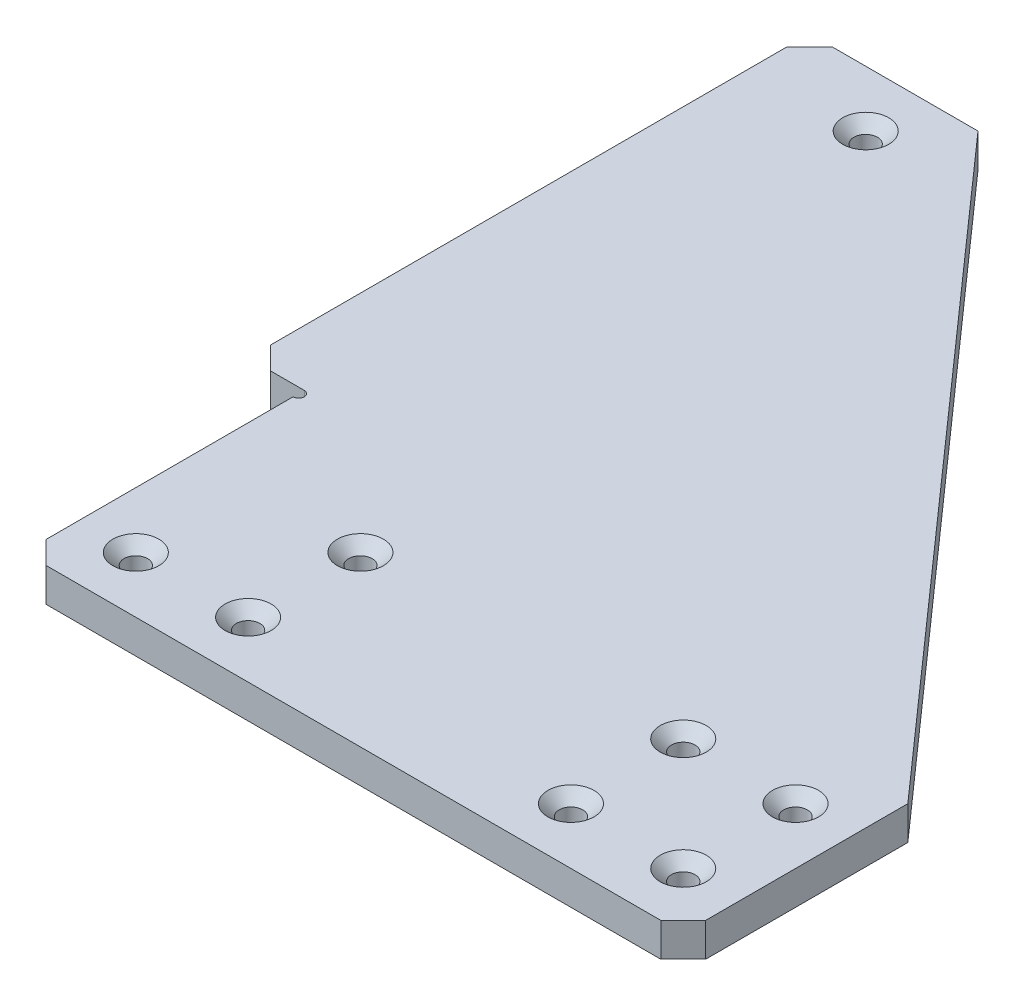
ISO-10303-21;
HEADER;
FILE_DESCRIPTION(('STEP AP214'),'2;1');
FILE_NAME('part.step','',(''),(''),'','','');
FILE_SCHEMA(('AUTOMOTIVE_DESIGN { 1 0 10303 214 1 1 1 1 }'));
ENDSEC;
DATA;
#1=APPLICATION_CONTEXT('core data for automotive mechanical design processes');
#2=APPLICATION_PROTOCOL_DEFINITION('international standard','automotive_design',2000,#1);
#3=PRODUCT_CONTEXT('',#1,'mechanical');
#4=PRODUCT('Part','Part','',(#3));
#5=PRODUCT_RELATED_PRODUCT_CATEGORY('part','',(#4));
#6=PRODUCT_DEFINITION_FORMATION('','',#4);
#7=PRODUCT_DEFINITION_CONTEXT('part definition',#1,'design');
#8=PRODUCT_DEFINITION('design','',#6,#7);
#9=PRODUCT_DEFINITION_SHAPE('','',#8);
#10=(LENGTH_UNIT() NAMED_UNIT(*) SI_UNIT(.MILLI.,.METRE.));
#11=(NAMED_UNIT(*) PLANE_ANGLE_UNIT() SI_UNIT($,.RADIAN.));
#12=(NAMED_UNIT(*) SI_UNIT($,.STERADIAN.) SOLID_ANGLE_UNIT());
#13=UNCERTAINTY_MEASURE_WITH_UNIT(LENGTH_MEASURE(1.E-05),#10,'distance_accuracy_value','');
#14=(GEOMETRIC_REPRESENTATION_CONTEXT(3) GLOBAL_UNCERTAINTY_ASSIGNED_CONTEXT((#13)) GLOBAL_UNIT_ASSIGNED_CONTEXT((#10,
#11,#12)) REPRESENTATION_CONTEXT('',''));
#15=CARTESIAN_POINT('',(0.,0.,0.));
#16=DIRECTION('',(0.,0.,1.));
#17=DIRECTION('',(1.,0.,0.));
#18=AXIS2_PLACEMENT_3D('',#15,#16,#17);
#19=CARTESIAN_POINT('',(0.,3.,0.));
#20=DIRECTION('',(0.,1.,0.));
#21=DIRECTION('',(0.,0.,1.));
#22=AXIS2_PLACEMENT_3D('',#19,#20,#21);
#23=PLANE('',#22);
#24=CARTESIAN_POINT('',(48.75,3.,-10.));
#25=DIRECTION('',(0.,1.,0.));
#26=DIRECTION('',(0.,0.,1.));
#27=AXIS2_PLACEMENT_3D('',#24,#25,#26);
#28=CIRCLE('',#27,4.09999999999996);
#29=CARTESIAN_POINT('',(48.75,3.,-5.90000000000005));
#30=VERTEX_POINT('',#29);
#31=EDGE_CURVE('E244',#30,#30,#28,.F.);
#32=ORIENTED_EDGE('',*,*,#31,.T.);
#33=EDGE_LOOP('',(#32));
#34=FACE_BOUND('',#33,.T.);
#35=CARTESIAN_POINT('',(48.75,3.,-30.));
#36=DIRECTION('',(0.,1.,0.));
#37=DIRECTION('',(0.,0.,1.));
#38=AXIS2_PLACEMENT_3D('',#35,#36,#37);
#39=CIRCLE('',#38,4.10000000000005);
#40=CARTESIAN_POINT('',(48.75,3.,-25.9));
#41=VERTEX_POINT('',#40);
#42=EDGE_CURVE('E241',#41,#41,#39,.F.);
#43=ORIENTED_EDGE('',*,*,#42,.T.);
#44=EDGE_LOOP('',(#43));
#45=FACE_BOUND('',#44,.T.);
#46=CARTESIAN_POINT('',(28.75,3.,-30.));
#47=DIRECTION('',(0.,1.,0.));
#48=DIRECTION('',(0.,0.,1.));
#49=AXIS2_PLACEMENT_3D('',#46,#47,#48);
#50=CIRCLE('',#49,4.10000000000005);
#51=CARTESIAN_POINT('',(28.75,3.,-25.9));
#52=VERTEX_POINT('',#51);
#53=EDGE_CURVE('E238',#52,#52,#50,.F.);
#54=ORIENTED_EDGE('',*,*,#53,.T.);
#55=EDGE_LOOP('',(#54));
#56=FACE_BOUND('',#55,.T.);
#57=CARTESIAN_POINT('',(28.75,3.,-10.));
#58=DIRECTION('',(0.,1.,0.));
#59=DIRECTION('',(0.,0.,1.));
#60=AXIS2_PLACEMENT_3D('',#57,#58,#59);
#61=CIRCLE('',#60,4.09999999999997);
#62=CARTESIAN_POINT('',(28.75,3.,-5.90000000000004));
#63=VERTEX_POINT('',#62);
#64=EDGE_CURVE('E235',#63,#63,#61,.F.);
#65=ORIENTED_EDGE('',*,*,#64,.T.);
#66=EDGE_LOOP('',(#65));
#67=FACE_BOUND('',#66,.T.);
#68=CARTESIAN_POINT('',(-48.75,3.,-10.));
#69=DIRECTION('',(0.,1.,0.));
#70=DIRECTION('',(0.,0.,1.));
#71=AXIS2_PLACEMENT_3D('',#68,#69,#70);
#72=CIRCLE('',#71,4.09999999999996);
#73=CARTESIAN_POINT('',(-48.75,3.,-5.90000000000004));
#74=VERTEX_POINT('',#73);
#75=EDGE_CURVE('E232',#74,#74,#72,.F.);
#76=ORIENTED_EDGE('',*,*,#75,.T.);
#77=EDGE_LOOP('',(#76));
#78=FACE_BOUND('',#77,.T.);
#79=CARTESIAN_POINT('',(-28.75,3.,-10.));
#80=DIRECTION('',(0.,1.,0.));
#81=DIRECTION('',(0.,0.,1.));
#82=AXIS2_PLACEMENT_3D('',#79,#80,#81);
#83=CIRCLE('',#82,4.09999999999997);
#84=CARTESIAN_POINT('',(-28.75,3.,-5.90000000000004));
#85=VERTEX_POINT('',#84);
#86=EDGE_CURVE('E229',#85,#85,#83,.F.);
#87=ORIENTED_EDGE('',*,*,#86,.T.);
#88=EDGE_LOOP('',(#87));
#89=FACE_BOUND('',#88,.T.);
#90=CARTESIAN_POINT('',(-28.75,3.,-30.));
#91=DIRECTION('',(0.,1.,0.));
#92=DIRECTION('',(0.,0.,1.));
#93=AXIS2_PLACEMENT_3D('',#90,#91,#92);
#94=CIRCLE('',#93,4.09999999999996);
#95=CARTESIAN_POINT('',(-28.75,3.,-25.9));
#96=VERTEX_POINT('',#95);
#97=EDGE_CURVE('E226',#96,#96,#94,.F.);
#98=ORIENTED_EDGE('',*,*,#97,.T.);
#99=EDGE_LOOP('',(#98));
#100=FACE_BOUND('',#99,.T.);
#101=CARTESIAN_POINT('',(-48.7500000000001,3.,-140.));
#102=DIRECTION('',(0.,1.,0.));
#103=DIRECTION('',(0.,0.,1.));
#104=AXIS2_PLACEMENT_3D('',#101,#102,#103);
#105=CIRCLE('',#104,4.09999999999997);
#106=CARTESIAN_POINT('',(-48.7500000000001,3.,-135.9));
#107=VERTEX_POINT('',#106);
#108=EDGE_CURVE('E223',#107,#107,#105,.F.);
#109=ORIENTED_EDGE('',*,*,#108,.T.);
#110=EDGE_LOOP('',(#109));
#111=FACE_BOUND('',#110,.T.);
#112=DIRECTION('',(-1.,0.,0.));
#113=VECTOR('',#112,1.);
#114=CARTESIAN_POINT('',(-38.75,3.,-150.));
#115=LINE('',#114,#113);
#116=CARTESIAN_POINT('',(-38.75,3.,-150.));
#117=VERTEX_POINT('',#116);
#118=CARTESIAN_POINT('',(-64.75,3.,-150.));
#119=VERTEX_POINT('',#118);
#120=EDGE_CURVE('E418',#117,#119,#115,.T.);
#121=ORIENTED_EDGE('',*,*,#120,.T.);
#122=DIRECTION('',(0.70710678118655,0.,-0.707106781186545));
#123=VECTOR('',#122,1.);
#124=CARTESIAN_POINT('',(-107.375,3.,-107.375000000001));
#125=LINE('',#124,#123);
#126=CARTESIAN_POINT('',(-68.75,3.,-146.));
#127=VERTEX_POINT('',#126);
#128=EDGE_CURVE('E206',#119,#127,#125,.F.);
#129=ORIENTED_EDGE('',*,*,#128,.T.);
#130=DIRECTION('',(0.,0.,1.));
#131=VECTOR('',#130,1.);
#132=CARTESIAN_POINT('',(-68.75,3.,-150.));
#133=LINE('',#132,#131);
#134=CARTESIAN_POINT('',(-68.75,3.,-54.0000000000001));
#135=VERTEX_POINT('',#134);
#136=EDGE_CURVE('E156',#127,#135,#133,.T.);
#137=ORIENTED_EDGE('',*,*,#136,.T.);
#138=DIRECTION('',(-0.707106781186548,0.,-0.707106781186548));
#139=VECTOR('',#138,1.);
#140=CARTESIAN_POINT('',(-7.37499999999999,3.,7.37499999999999));
#141=LINE('',#140,#139);
#142=CARTESIAN_POINT('',(-64.75,3.,-50.));
#143=VERTEX_POINT('',#142);
#144=EDGE_CURVE('E53',#135,#143,#141,.F.);
#145=ORIENTED_EDGE('',*,*,#144,.T.);
#146=DIRECTION('',(1.,0.,0.));
#147=VECTOR('',#146,1.);
#148=CARTESIAN_POINT('',(-68.75,3.,-50.));
#149=LINE('',#148,#147);
#150=CARTESIAN_POINT('',(-58.75,3.,-50.));
#151=VERTEX_POINT('',#150);
#152=EDGE_CURVE('E147',#143,#151,#149,.T.);
#153=ORIENTED_EDGE('',*,*,#152,.T.);
#154=CARTESIAN_POINT('',(-58.75,3.,-49.));
#155=DIRECTION('',(0.,1.,0.));
#156=DIRECTION('',(0.,0.,1.));
#157=AXIS2_PLACEMENT_3D('',#154,#155,#156);
#158=CIRCLE('',#157,0.999999999999998);
#159=CARTESIAN_POINT('',(-58.75,3.,-48.));
#160=VERTEX_POINT('',#159);
#161=EDGE_CURVE('E132',#160,#151,#158,.T.);
#162=ORIENTED_EDGE('',*,*,#161,.F.);
#163=DIRECTION('',(0.,0.,1.));
#164=VECTOR('',#163,1.);
#165=CARTESIAN_POINT('',(-58.75,3.,-50.));
#166=LINE('',#165,#164);
#167=CARTESIAN_POINT('',(-58.75,3.,-4.));
#168=VERTEX_POINT('',#167);
#169=EDGE_CURVE('E145',#160,#168,#166,.T.);
#170=ORIENTED_EDGE('',*,*,#169,.T.);
#171=DIRECTION('',(-0.707106781186548,0.,-0.707106781186548));
#172=VECTOR('',#171,1.);
#173=CARTESIAN_POINT('',(-27.375,3.,27.375));
#174=LINE('',#173,#172);
#175=CARTESIAN_POINT('',(-54.75,3.,0.));
#176=VERTEX_POINT('',#175);
#177=EDGE_CURVE('E203',#168,#176,#174,.F.);
#178=ORIENTED_EDGE('',*,*,#177,.T.);
#179=DIRECTION('',(1.,0.,0.));
#180=VECTOR('',#179,1.);
#181=CARTESIAN_POINT('',(-58.75,3.,0.));
#182=LINE('',#181,#180);
#183=CARTESIAN_POINT('',(54.7499999999999,3.,0.));
#184=VERTEX_POINT('',#183);
#185=EDGE_CURVE('E152',#176,#184,#182,.T.);
#186=ORIENTED_EDGE('',*,*,#185,.T.);
#187=DIRECTION('',(-0.70710678118655,0.,0.707106781186545));
#188=VECTOR('',#187,1.);
#189=CARTESIAN_POINT('',(27.3749999999998,3.,27.375));
#190=LINE('',#189,#188);
#191=CARTESIAN_POINT('',(58.75,3.,-4.00000000000003));
#192=VERTEX_POINT('',#191);
#193=EDGE_CURVE('E60',#184,#192,#190,.F.);
#194=ORIENTED_EDGE('',*,*,#193,.T.);
#195=DIRECTION('',(0.,0.,-1.));
#196=VECTOR('',#195,1.);
#197=CARTESIAN_POINT('',(58.75,3.,0.));
#198=LINE('',#197,#196);
#199=CARTESIAN_POINT('',(58.75,3.,-40.));
#200=VERTEX_POINT('',#199);
#201=EDGE_CURVE('E154',#192,#200,#198,.T.);
#202=ORIENTED_EDGE('',*,*,#201,.T.);
#203=DIRECTION('',(-0.663307514315852,0.,-0.74834693922814));
#204=VECTOR('',#203,1.);
#205=CARTESIAN_POINT('',(58.75,3.,-40.));
#206=LINE('',#205,#204);
#207=EDGE_CURVE('E181',#200,#117,#206,.T.);
#208=ORIENTED_EDGE('',*,*,#207,.T.);
#209=EDGE_LOOP('',(#121,#129,#137,#145,#153,#162,#170,#178,#186,#194,#202,#208));
#210=FACE_BOUND('',#209,.T.);
#211=ADVANCED_FACE('F37',(#34,#45,#56,#67,#78,#89,#100,#111,#210),#23,.T.);
#212=CARTESIAN_POINT('',(0.,-3.,0.));
#213=DIRECTION('',(0.,1.,0.));
#214=DIRECTION('',(0.,0.,1.));
#215=AXIS2_PLACEMENT_3D('',#212,#213,#214);
#216=PLANE('',#215);
#217=DIRECTION('',(0.,0.,1.));
#218=VECTOR('',#217,1.);
#219=CARTESIAN_POINT('',(-68.75,-3.,-150.));
#220=LINE('',#219,#218);
#221=CARTESIAN_POINT('',(-68.75,-3.,-146.));
#222=VERTEX_POINT('',#221);
#223=CARTESIAN_POINT('',(-68.75,-3.,-54.0000000000001));
#224=VERTEX_POINT('',#223);
#225=EDGE_CURVE('E169',#222,#224,#220,.T.);
#226=ORIENTED_EDGE('',*,*,#225,.F.);
#227=DIRECTION('',(-0.70710678118655,0.,0.707106781186545));
#228=VECTOR('',#227,1.);
#229=CARTESIAN_POINT('',(-68.75,-3.,-146.));
#230=LINE('',#229,#228);
#231=CARTESIAN_POINT('',(-64.75,-3.,-150.));
#232=VERTEX_POINT('',#231);
#233=EDGE_CURVE('E198',#222,#232,#230,.F.);
#234=ORIENTED_EDGE('',*,*,#233,.T.);
#235=DIRECTION('',(-1.,0.,0.));
#236=VECTOR('',#235,1.);
#237=CARTESIAN_POINT('',(-38.75,-3.,-150.));
#238=LINE('',#237,#236);
#239=CARTESIAN_POINT('',(-38.75,-3.,-150.));
#240=VERTEX_POINT('',#239);
#241=EDGE_CURVE('E165',#240,#232,#238,.T.);
#242=ORIENTED_EDGE('',*,*,#241,.F.);
#243=DIRECTION('',(-0.663307514315852,0.,-0.74834693922814));
#244=VECTOR('',#243,1.);
#245=CARTESIAN_POINT('',(58.75,-3.,-40.));
#246=LINE('',#245,#244);
#247=CARTESIAN_POINT('',(58.75,-3.,-40.));
#248=VERTEX_POINT('',#247);
#249=EDGE_CURVE('E162',#248,#240,#246,.T.);
#250=ORIENTED_EDGE('',*,*,#249,.F.);
#251=DIRECTION('',(0.,0.,-1.));
#252=VECTOR('',#251,1.);
#253=CARTESIAN_POINT('',(58.75,-3.,0.));
#254=LINE('',#253,#252);
#255=CARTESIAN_POINT('',(58.75,-3.,-4.00000000000003));
#256=VERTEX_POINT('',#255);
#257=EDGE_CURVE('E179',#256,#248,#254,.T.);
#258=ORIENTED_EDGE('',*,*,#257,.F.);
#259=DIRECTION('',(0.70710678118655,0.,-0.707106781186545));
#260=VECTOR('',#259,1.);
#261=CARTESIAN_POINT('',(58.75,-3.,-4.00000000000003));
#262=LINE('',#261,#260);
#263=CARTESIAN_POINT('',(54.7499999999999,-3.,0.));
#264=VERTEX_POINT('',#263);
#265=EDGE_CURVE('E196',#256,#264,#262,.F.);
#266=ORIENTED_EDGE('',*,*,#265,.T.);
#267=DIRECTION('',(1.,0.,0.));
#268=VECTOR('',#267,1.);
#269=CARTESIAN_POINT('',(-58.75,-3.,0.));
#270=LINE('',#269,#268);
#271=CARTESIAN_POINT('',(-54.75,-3.,0.));
#272=VERTEX_POINT('',#271);
#273=EDGE_CURVE('E176',#272,#264,#270,.T.);
#274=ORIENTED_EDGE('',*,*,#273,.F.);
#275=DIRECTION('',(0.707106781186548,0.,0.707106781186548));
#276=VECTOR('',#275,1.);
#277=CARTESIAN_POINT('',(-54.75,-3.,0.));
#278=LINE('',#277,#276);
#279=CARTESIAN_POINT('',(-58.75,-3.,-4.));
#280=VERTEX_POINT('',#279);
#281=EDGE_CURVE('E194',#272,#280,#278,.F.);
#282=ORIENTED_EDGE('',*,*,#281,.T.);
#283=DIRECTION('',(0.,0.,1.));
#284=VECTOR('',#283,1.);
#285=CARTESIAN_POINT('',(-58.75,-3.,-50.));
#286=LINE('',#285,#284);
#287=CARTESIAN_POINT('',(-58.75,-3.,-48.));
#288=VERTEX_POINT('',#287);
#289=EDGE_CURVE('E174',#288,#280,#286,.T.);
#290=ORIENTED_EDGE('',*,*,#289,.F.);
#291=CARTESIAN_POINT('',(-58.75,-3.,-49.));
#292=DIRECTION('',(0.,1.,0.));
#293=DIRECTION('',(0.,0.,1.));
#294=AXIS2_PLACEMENT_3D('',#291,#292,#293);
#295=CIRCLE('',#294,0.999999999999998);
#296=CARTESIAN_POINT('',(-58.75,-3.,-50.));
#297=VERTEX_POINT('',#296);
#298=EDGE_CURVE('E135',#288,#297,#295,.T.);
#299=ORIENTED_EDGE('',*,*,#298,.T.);
#300=DIRECTION('',(1.,0.,0.));
#301=VECTOR('',#300,1.);
#302=CARTESIAN_POINT('',(-68.75,-3.,-50.));
#303=LINE('',#302,#301);
#304=CARTESIAN_POINT('',(-64.75,-3.,-50.));
#305=VERTEX_POINT('',#304);
#306=EDGE_CURVE('E172',#305,#297,#303,.T.);
#307=ORIENTED_EDGE('',*,*,#306,.F.);
#308=DIRECTION('',(0.707106781186548,0.,0.707106781186548));
#309=VECTOR('',#308,1.);
#310=CARTESIAN_POINT('',(-64.75,-3.,-50.));
#311=LINE('',#310,#309);
#312=EDGE_CURVE('E192',#305,#224,#311,.F.);
#313=ORIENTED_EDGE('',*,*,#312,.T.);
#314=EDGE_LOOP('',(#226,#234,#242,#250,#258,#266,#274,#282,#290,#299,#307,#313));
#315=FACE_BOUND('',#314,.T.);
#316=CARTESIAN_POINT('',(-48.7500000000001,-3.,-140.));
#317=DIRECTION('',(0.,1.,0.));
#318=DIRECTION('',(0.,0.,1.));
#319=AXIS2_PLACEMENT_3D('',#316,#317,#318);
#320=CIRCLE('',#319,2.1);
#321=CARTESIAN_POINT('',(-48.7500000000001,-3.,-137.9));
#322=VERTEX_POINT('',#321);
#323=EDGE_CURVE('E166',#322,#322,#320,.T.);
#324=ORIENTED_EDGE('',*,*,#323,.T.);
#325=EDGE_LOOP('',(#324));
#326=FACE_BOUND('',#325,.T.);
#327=CARTESIAN_POINT('',(-28.75,-3.,-30.));
#328=DIRECTION('',(0.,1.,0.));
#329=DIRECTION('',(0.,0.,1.));
#330=AXIS2_PLACEMENT_3D('',#327,#328,#329);
#331=CIRCLE('',#330,2.1);
#332=CARTESIAN_POINT('',(-28.75,-3.,-27.9));
#333=VERTEX_POINT('',#332);
#334=EDGE_CURVE('E404',#333,#333,#331,.T.);
#335=ORIENTED_EDGE('',*,*,#334,.T.);
#336=EDGE_LOOP('',(#335));
#337=FACE_BOUND('',#336,.T.);
#338=CARTESIAN_POINT('',(-48.75,-3.,-10.));
#339=DIRECTION('',(0.,1.,0.));
#340=DIRECTION('',(0.,0.,1.));
#341=AXIS2_PLACEMENT_3D('',#338,#339,#340);
#342=CIRCLE('',#341,2.1);
#343=CARTESIAN_POINT('',(-48.75,-3.,-7.9));
#344=VERTEX_POINT('',#343);
#345=EDGE_CURVE('E402',#344,#344,#342,.T.);
#346=ORIENTED_EDGE('',*,*,#345,.T.);
#347=EDGE_LOOP('',(#346));
#348=FACE_BOUND('',#347,.T.);
#349=CARTESIAN_POINT('',(28.75,-3.,-30.));
#350=DIRECTION('',(0.,1.,0.));
#351=DIRECTION('',(0.,0.,1.));
#352=AXIS2_PLACEMENT_3D('',#349,#350,#351);
#353=CIRCLE('',#352,2.1);
#354=CARTESIAN_POINT('',(28.75,-3.,-27.9));
#355=VERTEX_POINT('',#354);
#356=EDGE_CURVE('E405',#355,#355,#353,.T.);
#357=ORIENTED_EDGE('',*,*,#356,.T.);
#358=EDGE_LOOP('',(#357));
#359=FACE_BOUND('',#358,.T.);
#360=CARTESIAN_POINT('',(-28.75,-3.,-10.));
#361=DIRECTION('',(0.,1.,0.));
#362=DIRECTION('',(0.,0.,1.));
#363=AXIS2_PLACEMENT_3D('',#360,#361,#362);
#364=CIRCLE('',#363,2.1);
#365=CARTESIAN_POINT('',(-28.75,-3.,-7.9));
#366=VERTEX_POINT('',#365);
#367=EDGE_CURVE('E410',#366,#366,#364,.T.);
#368=ORIENTED_EDGE('',*,*,#367,.T.);
#369=EDGE_LOOP('',(#368));
#370=FACE_BOUND('',#369,.T.);
#371=CARTESIAN_POINT('',(28.75,-3.,-10.));
#372=DIRECTION('',(0.,1.,0.));
#373=DIRECTION('',(0.,0.,1.));
#374=AXIS2_PLACEMENT_3D('',#371,#372,#373);
#375=CIRCLE('',#374,2.1);
#376=CARTESIAN_POINT('',(28.75,-3.,-7.9));
#377=VERTEX_POINT('',#376);
#378=EDGE_CURVE('E435',#377,#377,#375,.T.);
#379=ORIENTED_EDGE('',*,*,#378,.T.);
#380=EDGE_LOOP('',(#379));
#381=FACE_BOUND('',#380,.T.);
#382=CARTESIAN_POINT('',(48.75,-3.,-10.));
#383=DIRECTION('',(0.,1.,0.));
#384=DIRECTION('',(0.,0.,1.));
#385=AXIS2_PLACEMENT_3D('',#382,#383,#384);
#386=CIRCLE('',#385,2.1);
#387=CARTESIAN_POINT('',(48.75,-3.,-7.90000000000001));
#388=VERTEX_POINT('',#387);
#389=EDGE_CURVE('E430',#388,#388,#386,.T.);
#390=ORIENTED_EDGE('',*,*,#389,.T.);
#391=EDGE_LOOP('',(#390));
#392=FACE_BOUND('',#391,.T.);
#393=CARTESIAN_POINT('',(48.75,-3.,-30.));
#394=DIRECTION('',(0.,1.,0.));
#395=DIRECTION('',(0.,0.,1.));
#396=AXIS2_PLACEMENT_3D('',#393,#394,#395);
#397=CIRCLE('',#396,2.1);
#398=CARTESIAN_POINT('',(48.75,-3.,-27.9));
#399=VERTEX_POINT('',#398);
#400=EDGE_CURVE('E427',#399,#399,#397,.T.);
#401=ORIENTED_EDGE('',*,*,#400,.T.);
#402=EDGE_LOOP('',(#401));
#403=FACE_BOUND('',#402,.T.);
#404=ADVANCED_FACE('F282',(#315,#326,#337,#348,#359,#370,#381,#392,#403),#216,.F.);
#405=CARTESIAN_POINT('',(58.75,3.,-40.));
#406=DIRECTION('',(-0.74834693922814,0.,0.663307514315852));
#407=DIRECTION('',(0.663307514315852,0.,0.74834693922814));
#408=AXIS2_PLACEMENT_3D('',#405,#406,#407);
#409=PLANE('',#408);
#410=ORIENTED_EDGE('',*,*,#249,.T.);
#411=DIRECTION('',(0.,-1.,0.));
#412=VECTOR('',#411,1.);
#413=CARTESIAN_POINT('',(-38.75,3.,-150.));
#414=LINE('',#413,#412);
#415=EDGE_CURVE('E141',#117,#240,#414,.T.);
#416=ORIENTED_EDGE('',*,*,#415,.F.);
#417=ORIENTED_EDGE('',*,*,#207,.F.);
#418=DIRECTION('',(0.,-1.,0.));
#419=VECTOR('',#418,1.);
#420=CARTESIAN_POINT('',(58.75,3.,-40.));
#421=LINE('',#420,#419);
#422=EDGE_CURVE('E161',#200,#248,#421,.T.);
#423=ORIENTED_EDGE('',*,*,#422,.T.);
#424=EDGE_LOOP('',(#410,#416,#417,#423));
#425=FACE_BOUND('',#424,.T.);
#426=ADVANCED_FACE('F288',(#425),#409,.F.);
#427=CARTESIAN_POINT('',(-38.75,3.,-150.));
#428=DIRECTION('',(0.,0.,1.));
#429=DIRECTION('',(1.,0.,0.));
#430=AXIS2_PLACEMENT_3D('',#427,#428,#429);
#431=PLANE('',#430);
#432=ORIENTED_EDGE('',*,*,#241,.T.);
#433=DIRECTION('',(0.,1.,0.));
#434=VECTOR('',#433,1.);
#435=CARTESIAN_POINT('',(-64.75,3.,-150.));
#436=LINE('',#435,#434);
#437=EDGE_CURVE('E200',#232,#119,#436,.T.);
#438=ORIENTED_EDGE('',*,*,#437,.T.);
#439=ORIENTED_EDGE('',*,*,#120,.F.);
#440=ORIENTED_EDGE('',*,*,#415,.T.);
#441=EDGE_LOOP('',(#432,#438,#439,#440));
#442=FACE_BOUND('',#441,.T.);
#443=ADVANCED_FACE('F313',(#442),#431,.F.);
#444=CARTESIAN_POINT('',(-68.75,3.,-150.));
#445=DIRECTION('',(1.,0.,0.));
#446=DIRECTION('',(0.,0.,-1.));
#447=AXIS2_PLACEMENT_3D('',#444,#445,#446);
#448=PLANE('',#447);
#449=ORIENTED_EDGE('',*,*,#136,.F.);
#450=DIRECTION('',(0.,-1.,0.));
#451=VECTOR('',#450,1.);
#452=CARTESIAN_POINT('',(-68.75,3.,-146.));
#453=LINE('',#452,#451);
#454=EDGE_CURVE('E189',#127,#222,#453,.T.);
#455=ORIENTED_EDGE('',*,*,#454,.T.);
#456=ORIENTED_EDGE('',*,*,#225,.T.);
#457=DIRECTION('',(0.,1.,0.));
#458=VECTOR('',#457,1.);
#459=CARTESIAN_POINT('',(-68.75,3.,-54.));
#460=LINE('',#459,#458);
#461=EDGE_CURVE('E140',#224,#135,#460,.T.);
#462=ORIENTED_EDGE('',*,*,#461,.T.);
#463=EDGE_LOOP('',(#449,#455,#456,#462));
#464=FACE_BOUND('',#463,.T.);
#465=ADVANCED_FACE('F309',(#464),#448,.F.);
#466=CARTESIAN_POINT('',(-68.75,3.,-50.));
#467=DIRECTION('',(0.,0.,-1.));
#468=DIRECTION('',(-1.,0.,0.));
#469=AXIS2_PLACEMENT_3D('',#466,#467,#468);
#470=PLANE('',#469);
#471=ORIENTED_EDGE('',*,*,#152,.F.);
#472=DIRECTION('',(0.,-1.,0.));
#473=VECTOR('',#472,1.);
#474=CARTESIAN_POINT('',(-64.75,3.,-50.));
#475=LINE('',#474,#473);
#476=EDGE_CURVE('E217',#143,#305,#475,.T.);
#477=ORIENTED_EDGE('',*,*,#476,.T.);
#478=ORIENTED_EDGE('',*,*,#306,.T.);
#479=DIRECTION('',(0.,-1.,0.));
#480=VECTOR('',#479,1.);
#481=CARTESIAN_POINT('',(-58.75,3.,-50.));
#482=LINE('',#481,#480);
#483=EDGE_CURVE('E184',#151,#297,#482,.T.);
#484=ORIENTED_EDGE('',*,*,#483,.F.);
#485=EDGE_LOOP('',(#471,#477,#478,#484));
#486=FACE_BOUND('',#485,.T.);
#487=ADVANCED_FACE('F306',(#486),#470,.F.);
#488=CARTESIAN_POINT('',(-58.75,3.,-50.));
#489=DIRECTION('',(1.,0.,0.));
#490=DIRECTION('',(0.,0.,-1.));
#491=AXIS2_PLACEMENT_3D('',#488,#489,#490);
#492=PLANE('',#491);
#493=ORIENTED_EDGE('',*,*,#289,.T.);
#494=DIRECTION('',(0.,1.,0.));
#495=VECTOR('',#494,1.);
#496=CARTESIAN_POINT('',(-58.75,3.,-4.));
#497=LINE('',#496,#495);
#498=EDGE_CURVE('E151',#280,#168,#497,.T.);
#499=ORIENTED_EDGE('',*,*,#498,.T.);
#500=ORIENTED_EDGE('',*,*,#169,.F.);
#501=DIRECTION('',(0.,1.,0.));
#502=VECTOR('',#501,1.);
#503=CARTESIAN_POINT('',(-58.75,-3.,-48.));
#504=LINE('',#503,#502);
#505=EDGE_CURVE('E128',#160,#288,#504,.F.);
#506=ORIENTED_EDGE('',*,*,#505,.T.);
#507=EDGE_LOOP('',(#493,#499,#500,#506));
#508=FACE_BOUND('',#507,.T.);
#509=ADVANCED_FACE('F149',(#508),#492,.F.);
#510=CARTESIAN_POINT('',(-58.75,3.,0.));
#511=DIRECTION('',(0.,0.,-1.));
#512=DIRECTION('',(-1.,0.,0.));
#513=AXIS2_PLACEMENT_3D('',#510,#511,#512);
#514=PLANE('',#513);
#515=ORIENTED_EDGE('',*,*,#273,.T.);
#516=DIRECTION('',(0.,1.,0.));
#517=VECTOR('',#516,1.);
#518=CARTESIAN_POINT('',(54.7499999999999,3.,0.));
#519=LINE('',#518,#517);
#520=EDGE_CURVE('E214',#264,#184,#519,.T.);
#521=ORIENTED_EDGE('',*,*,#520,.T.);
#522=ORIENTED_EDGE('',*,*,#185,.F.);
#523=DIRECTION('',(0.,-1.,0.));
#524=VECTOR('',#523,1.);
#525=CARTESIAN_POINT('',(-54.75,3.,0.));
#526=LINE('',#525,#524);
#527=EDGE_CURVE('E211',#176,#272,#526,.T.);
#528=ORIENTED_EDGE('',*,*,#527,.T.);
#529=EDGE_LOOP('',(#515,#521,#522,#528));
#530=FACE_BOUND('',#529,.T.);
#531=ADVANCED_FACE('F299',(#530),#514,.F.);
#532=CARTESIAN_POINT('',(58.75,3.,0.));
#533=DIRECTION('',(-1.,0.,0.));
#534=DIRECTION('',(0.,0.,1.));
#535=AXIS2_PLACEMENT_3D('',#532,#533,#534);
#536=PLANE('',#535);
#537=ORIENTED_EDGE('',*,*,#201,.F.);
#538=DIRECTION('',(0.,-1.,0.));
#539=VECTOR('',#538,1.);
#540=CARTESIAN_POINT('',(58.75,3.,-4.00000000000003));
#541=LINE('',#540,#539);
#542=EDGE_CURVE('E208',#192,#256,#541,.T.);
#543=ORIENTED_EDGE('',*,*,#542,.T.);
#544=ORIENTED_EDGE('',*,*,#257,.T.);
#545=ORIENTED_EDGE('',*,*,#422,.F.);
#546=EDGE_LOOP('',(#537,#543,#544,#545));
#547=FACE_BOUND('',#546,.T.);
#548=ADVANCED_FACE('F296',(#547),#536,.F.);
#549=CARTESIAN_POINT('',(-48.7500000000001,3.,-140.));
#550=DIRECTION('',(0.,-1.,0.));
#551=DIRECTION('',(0.,0.,-1.));
#552=AXIS2_PLACEMENT_3D('',#549,#550,#551);
#553=CYLINDRICAL_SURFACE('',#552,2.1);
#554=CARTESIAN_POINT('',(-48.7500000000001,1.00000000000003,-140.));
#555=DIRECTION('',(0.,1.,0.));
#556=DIRECTION('',(0.,0.,1.));
#557=AXIS2_PLACEMENT_3D('',#554,#555,#556);
#558=CIRCLE('',#557,2.1);
#559=CARTESIAN_POINT('',(-48.7500000000001,1.00000000000003,-137.9));
#560=VERTEX_POINT('',#559);
#561=EDGE_CURVE('E11',#560,#560,#558,.T.);
#562=ORIENTED_EDGE('',*,*,#561,.T.);
#563=EDGE_LOOP('',(#562));
#564=FACE_BOUND('',#563,.T.);
#565=ORIENTED_EDGE('',*,*,#323,.F.);
#566=EDGE_LOOP('',(#565));
#567=FACE_BOUND('',#566,.T.);
#568=ADVANCED_FACE('F293',(#564,#567),#553,.F.);
#569=CARTESIAN_POINT('',(-28.75,3.,-30.));
#570=DIRECTION('',(0.,-1.,0.));
#571=DIRECTION('',(0.,0.,-1.));
#572=AXIS2_PLACEMENT_3D('',#569,#570,#571);
#573=CYLINDRICAL_SURFACE('',#572,2.1);
#574=CARTESIAN_POINT('',(-28.75,1.00000000000003,-30.));
#575=DIRECTION('',(0.,1.,0.));
#576=DIRECTION('',(0.,0.,1.));
#577=AXIS2_PLACEMENT_3D('',#574,#575,#576);
#578=CIRCLE('',#577,2.1);
#579=CARTESIAN_POINT('',(-28.75,1.00000000000003,-27.9));
#580=VERTEX_POINT('',#579);
#581=EDGE_CURVE('E46',#580,#580,#578,.T.);
#582=ORIENTED_EDGE('',*,*,#581,.T.);
#583=EDGE_LOOP('',(#582));
#584=FACE_BOUND('',#583,.T.);
#585=ORIENTED_EDGE('',*,*,#334,.F.);
#586=EDGE_LOOP('',(#585));
#587=FACE_BOUND('',#586,.T.);
#588=ADVANCED_FACE('F264',(#584,#587),#573,.F.);
#589=CARTESIAN_POINT('',(-48.75,3.,-10.));
#590=DIRECTION('',(0.,-1.,0.));
#591=DIRECTION('',(0.,0.,-1.));
#592=AXIS2_PLACEMENT_3D('',#589,#590,#591);
#593=CYLINDRICAL_SURFACE('',#592,2.1);
#594=CARTESIAN_POINT('',(-48.75,1.00000000000002,-10.));
#595=DIRECTION('',(0.,1.,0.));
#596=DIRECTION('',(0.,0.,1.));
#597=AXIS2_PLACEMENT_3D('',#594,#595,#596);
#598=CIRCLE('',#597,2.1);
#599=CARTESIAN_POINT('',(-48.75,1.00000000000002,-7.9));
#600=VERTEX_POINT('',#599);
#601=EDGE_CURVE('E256',#600,#600,#598,.T.);
#602=ORIENTED_EDGE('',*,*,#601,.T.);
#603=EDGE_LOOP('',(#602));
#604=FACE_BOUND('',#603,.T.);
#605=ORIENTED_EDGE('',*,*,#345,.F.);
#606=EDGE_LOOP('',(#605));
#607=FACE_BOUND('',#606,.T.);
#608=ADVANCED_FACE('F395',(#604,#607),#593,.F.);
#609=CARTESIAN_POINT('',(28.75,3.,-30.));
#610=DIRECTION('',(0.,-1.,0.));
#611=DIRECTION('',(0.,0.,-1.));
#612=AXIS2_PLACEMENT_3D('',#609,#610,#611);
#613=CYLINDRICAL_SURFACE('',#612,2.1);
#614=CARTESIAN_POINT('',(28.75,0.999999999999949,-30.));
#615=DIRECTION('',(0.,1.,0.));
#616=DIRECTION('',(0.,0.,1.));
#617=AXIS2_PLACEMENT_3D('',#614,#615,#616);
#618=CIRCLE('',#617,2.1);
#619=CARTESIAN_POINT('',(28.75,0.999999999999949,-27.9));
#620=VERTEX_POINT('',#619);
#621=EDGE_CURVE('E250',#620,#620,#618,.T.);
#622=ORIENTED_EDGE('',*,*,#621,.T.);
#623=EDGE_LOOP('',(#622));
#624=FACE_BOUND('',#623,.T.);
#625=ORIENTED_EDGE('',*,*,#356,.F.);
#626=EDGE_LOOP('',(#625));
#627=FACE_BOUND('',#626,.T.);
#628=ADVANCED_FACE('F398',(#624,#627),#613,.F.);
#629=CARTESIAN_POINT('',(-28.75,3.,-10.));
#630=DIRECTION('',(0.,-1.,0.));
#631=DIRECTION('',(0.,0.,-1.));
#632=AXIS2_PLACEMENT_3D('',#629,#630,#631);
#633=CYLINDRICAL_SURFACE('',#632,2.1);
#634=CARTESIAN_POINT('',(-28.75,1.00000000000003,-10.));
#635=DIRECTION('',(0.,1.,0.));
#636=DIRECTION('',(0.,0.,1.));
#637=AXIS2_PLACEMENT_3D('',#634,#635,#636);
#638=CIRCLE('',#637,2.1);
#639=CARTESIAN_POINT('',(-28.75,1.00000000000003,-7.9));
#640=VERTEX_POINT('',#639);
#641=EDGE_CURVE('E259',#640,#640,#638,.T.);
#642=ORIENTED_EDGE('',*,*,#641,.T.);
#643=EDGE_LOOP('',(#642));
#644=FACE_BOUND('',#643,.T.);
#645=ORIENTED_EDGE('',*,*,#367,.F.);
#646=EDGE_LOOP('',(#645));
#647=FACE_BOUND('',#646,.T.);
#648=ADVANCED_FACE('F442',(#644,#647),#633,.F.);
#649=CARTESIAN_POINT('',(28.75,3.,-10.));
#650=DIRECTION('',(0.,-1.,0.));
#651=DIRECTION('',(0.,0.,-1.));
#652=AXIS2_PLACEMENT_3D('',#649,#650,#651);
#653=CYLINDRICAL_SURFACE('',#652,2.1);
#654=CARTESIAN_POINT('',(28.75,1.00000000000003,-10.));
#655=DIRECTION('',(0.,1.,0.));
#656=DIRECTION('',(0.,0.,1.));
#657=AXIS2_PLACEMENT_3D('',#654,#655,#656);
#658=CIRCLE('',#657,2.1);
#659=CARTESIAN_POINT('',(28.75,1.00000000000003,-7.9));
#660=VERTEX_POINT('',#659);
#661=EDGE_CURVE('E253',#660,#660,#658,.T.);
#662=ORIENTED_EDGE('',*,*,#661,.T.);
#663=EDGE_LOOP('',(#662));
#664=FACE_BOUND('',#663,.T.);
#665=ORIENTED_EDGE('',*,*,#378,.F.);
#666=EDGE_LOOP('',(#665));
#667=FACE_BOUND('',#666,.T.);
#668=ADVANCED_FACE('F444',(#664,#667),#653,.F.);
#669=CARTESIAN_POINT('',(48.75,3.,-10.));
#670=DIRECTION('',(0.,-1.,0.));
#671=DIRECTION('',(0.,0.,-1.));
#672=AXIS2_PLACEMENT_3D('',#669,#670,#671);
#673=CYLINDRICAL_SURFACE('',#672,2.1);
#674=CARTESIAN_POINT('',(48.75,1.00000000000002,-10.));
#675=DIRECTION('',(0.,1.,0.));
#676=DIRECTION('',(0.,0.,1.));
#677=AXIS2_PLACEMENT_3D('',#674,#675,#676);
#678=CIRCLE('',#677,2.1);
#679=CARTESIAN_POINT('',(48.75,1.00000000000002,-7.90000000000001));
#680=VERTEX_POINT('',#679);
#681=EDGE_CURVE('E220',#680,#680,#678,.T.);
#682=ORIENTED_EDGE('',*,*,#681,.T.);
#683=EDGE_LOOP('',(#682));
#684=FACE_BOUND('',#683,.T.);
#685=ORIENTED_EDGE('',*,*,#389,.F.);
#686=EDGE_LOOP('',(#685));
#687=FACE_BOUND('',#686,.T.);
#688=ADVANCED_FACE('F451',(#684,#687),#673,.F.);
#689=CARTESIAN_POINT('',(48.75,3.,-30.));
#690=DIRECTION('',(0.,-1.,0.));
#691=DIRECTION('',(0.,0.,-1.));
#692=AXIS2_PLACEMENT_3D('',#689,#690,#691);
#693=CYLINDRICAL_SURFACE('',#692,2.1);
#694=CARTESIAN_POINT('',(48.75,0.999999999999942,-30.));
#695=DIRECTION('',(0.,1.,0.));
#696=DIRECTION('',(0.,0.,1.));
#697=AXIS2_PLACEMENT_3D('',#694,#695,#696);
#698=CIRCLE('',#697,2.1);
#699=CARTESIAN_POINT('',(48.75,0.999999999999942,-27.9));
#700=VERTEX_POINT('',#699);
#701=EDGE_CURVE('E247',#700,#700,#698,.T.);
#702=ORIENTED_EDGE('',*,*,#701,.T.);
#703=EDGE_LOOP('',(#702));
#704=FACE_BOUND('',#703,.T.);
#705=ORIENTED_EDGE('',*,*,#400,.F.);
#706=EDGE_LOOP('',(#705));
#707=FACE_BOUND('',#706,.T.);
#708=ADVANCED_FACE('F515',(#704,#707),#693,.F.);
#709=CARTESIAN_POINT('',(-58.75,-3.,-49.));
#710=DIRECTION('',(0.,1.,0.));
#711=DIRECTION('',(0.,0.,1.));
#712=AXIS2_PLACEMENT_3D('',#709,#710,#711);
#713=CYLINDRICAL_SURFACE('',#712,0.999999999999998);
#714=ORIENTED_EDGE('',*,*,#298,.F.);
#715=ORIENTED_EDGE('',*,*,#505,.F.);
#716=ORIENTED_EDGE('',*,*,#161,.T.);
#717=ORIENTED_EDGE('',*,*,#483,.T.);
#718=EDGE_LOOP('',(#714,#715,#716,#717));
#719=FACE_BOUND('',#718,.T.);
#720=ADVANCED_FACE('F130',(#719),#713,.F.);
#721=CARTESIAN_POINT('',(-68.75,3.,-146.));
#722=DIRECTION('',(0.707106781186545,0.,0.70710678118655));
#723=DIRECTION('',(0.,-1.,0.));
#724=AXIS2_PLACEMENT_3D('',#721,#722,#723);
#725=PLANE('',#724);
#726=ORIENTED_EDGE('',*,*,#128,.F.);
#727=ORIENTED_EDGE('',*,*,#437,.F.);
#728=ORIENTED_EDGE('',*,*,#233,.F.);
#729=ORIENTED_EDGE('',*,*,#454,.F.);
#730=EDGE_LOOP('',(#726,#727,#728,#729));
#731=FACE_BOUND('',#730,.T.);
#732=ADVANCED_FACE('F322',(#731),#725,.F.);
#733=CARTESIAN_POINT('',(58.75,3.,-4.00000000000003));
#734=DIRECTION('',(-0.707106781186545,0.,-0.70710678118655));
#735=DIRECTION('',(0.,-1.,0.));
#736=AXIS2_PLACEMENT_3D('',#733,#734,#735);
#737=PLANE('',#736);
#738=ORIENTED_EDGE('',*,*,#193,.F.);
#739=ORIENTED_EDGE('',*,*,#520,.F.);
#740=ORIENTED_EDGE('',*,*,#265,.F.);
#741=ORIENTED_EDGE('',*,*,#542,.F.);
#742=EDGE_LOOP('',(#738,#739,#740,#741));
#743=FACE_BOUND('',#742,.T.);
#744=ADVANCED_FACE('F328',(#743),#737,.F.);
#745=CARTESIAN_POINT('',(-54.75,3.,0.));
#746=DIRECTION('',(0.707106781186547,0.,-0.707106781186547));
#747=DIRECTION('',(0.,-1.,0.));
#748=AXIS2_PLACEMENT_3D('',#745,#746,#747);
#749=PLANE('',#748);
#750=ORIENTED_EDGE('',*,*,#177,.F.);
#751=ORIENTED_EDGE('',*,*,#498,.F.);
#752=ORIENTED_EDGE('',*,*,#281,.F.);
#753=ORIENTED_EDGE('',*,*,#527,.F.);
#754=EDGE_LOOP('',(#750,#751,#752,#753));
#755=FACE_BOUND('',#754,.T.);
#756=ADVANCED_FACE('F335',(#755),#749,.F.);
#757=CARTESIAN_POINT('',(-64.75,3.,-50.));
#758=DIRECTION('',(0.707106781186547,0.,-0.707106781186547));
#759=DIRECTION('',(0.,-1.,0.));
#760=AXIS2_PLACEMENT_3D('',#757,#758,#759);
#761=PLANE('',#760);
#762=ORIENTED_EDGE('',*,*,#144,.F.);
#763=ORIENTED_EDGE('',*,*,#461,.F.);
#764=ORIENTED_EDGE('',*,*,#312,.F.);
#765=ORIENTED_EDGE('',*,*,#476,.F.);
#766=EDGE_LOOP('',(#762,#763,#764,#765));
#767=FACE_BOUND('',#766,.T.);
#768=ADVANCED_FACE('F342',(#767),#761,.F.);
#769=CARTESIAN_POINT('',(48.75,1.00000000000002,-10.));
#770=DIRECTION('',(0.,1.,0.));
#771=DIRECTION('',(0.,0.,1.));
#772=AXIS2_PLACEMENT_3D('',#769,#770,#771);
#773=CONICAL_SURFACE('',#772,2.1,0.785398163397446);
#774=ORIENTED_EDGE('',*,*,#31,.F.);
#775=EDGE_LOOP('',(#774));
#776=FACE_BOUND('',#775,.T.);
#777=ORIENTED_EDGE('',*,*,#681,.F.);
#778=EDGE_LOOP('',(#777));
#779=FACE_BOUND('',#778,.T.);
#780=ADVANCED_FACE('F349',(#776,#779),#773,.F.);
#781=CARTESIAN_POINT('',(48.75,0.999999999999942,-30.));
#782=DIRECTION('',(0.,1.,0.));
#783=DIRECTION('',(0.,0.,1.));
#784=AXIS2_PLACEMENT_3D('',#781,#782,#783);
#785=CONICAL_SURFACE('',#784,2.1,0.785398163397446);
#786=ORIENTED_EDGE('',*,*,#42,.F.);
#787=EDGE_LOOP('',(#786));
#788=FACE_BOUND('',#787,.T.);
#789=ORIENTED_EDGE('',*,*,#701,.F.);
#790=EDGE_LOOP('',(#789));
#791=FACE_BOUND('',#790,.T.);
#792=ADVANCED_FACE('F356',(#788,#791),#785,.F.);
#793=CARTESIAN_POINT('',(28.75,0.999999999999949,-30.));
#794=DIRECTION('',(0.,1.,0.));
#795=DIRECTION('',(0.,0.,1.));
#796=AXIS2_PLACEMENT_3D('',#793,#794,#795);
#797=CONICAL_SURFACE('',#796,2.1,0.785398163397447);
#798=ORIENTED_EDGE('',*,*,#53,.F.);
#799=EDGE_LOOP('',(#798));
#800=FACE_BOUND('',#799,.T.);
#801=ORIENTED_EDGE('',*,*,#621,.F.);
#802=EDGE_LOOP('',(#801));
#803=FACE_BOUND('',#802,.T.);
#804=ADVANCED_FACE('F363',(#800,#803),#797,.F.);
#805=CARTESIAN_POINT('',(28.75,1.00000000000003,-10.));
#806=DIRECTION('',(0.,1.,0.));
#807=DIRECTION('',(0.,0.,1.));
#808=AXIS2_PLACEMENT_3D('',#805,#806,#807);
#809=CONICAL_SURFACE('',#808,2.1,0.785398163397446);
#810=ORIENTED_EDGE('',*,*,#64,.F.);
#811=EDGE_LOOP('',(#810));
#812=FACE_BOUND('',#811,.T.);
#813=ORIENTED_EDGE('',*,*,#661,.F.);
#814=EDGE_LOOP('',(#813));
#815=FACE_BOUND('',#814,.T.);
#816=ADVANCED_FACE('F370',(#812,#815),#809,.F.);
#817=CARTESIAN_POINT('',(-48.75,1.00000000000002,-10.));
#818=DIRECTION('',(0.,1.,0.));
#819=DIRECTION('',(0.,0.,1.));
#820=AXIS2_PLACEMENT_3D('',#817,#818,#819);
#821=CONICAL_SURFACE('',#820,2.1,0.785398163397446);
#822=ORIENTED_EDGE('',*,*,#75,.F.);
#823=EDGE_LOOP('',(#822));
#824=FACE_BOUND('',#823,.T.);
#825=ORIENTED_EDGE('',*,*,#601,.F.);
#826=EDGE_LOOP('',(#825));
#827=FACE_BOUND('',#826,.T.);
#828=ADVANCED_FACE('F276',(#824,#827),#821,.F.);
#829=CARTESIAN_POINT('',(-28.75,1.00000000000003,-10.));
#830=DIRECTION('',(0.,1.,0.));
#831=DIRECTION('',(0.,0.,1.));
#832=AXIS2_PLACEMENT_3D('',#829,#830,#831);
#833=CONICAL_SURFACE('',#832,2.1,0.785398163397446);
#834=ORIENTED_EDGE('',*,*,#86,.F.);
#835=EDGE_LOOP('',(#834));
#836=FACE_BOUND('',#835,.T.);
#837=ORIENTED_EDGE('',*,*,#641,.F.);
#838=EDGE_LOOP('',(#837));
#839=FACE_BOUND('',#838,.T.);
#840=ADVANCED_FACE('F269',(#836,#839),#833,.F.);
#841=CARTESIAN_POINT('',(-28.75,1.00000000000003,-30.));
#842=DIRECTION('',(0.,1.,0.));
#843=DIRECTION('',(0.,0.,1.));
#844=AXIS2_PLACEMENT_3D('',#841,#842,#843);
#845=CONICAL_SURFACE('',#844,2.1,0.785398163397446);
#846=ORIENTED_EDGE('',*,*,#97,.F.);
#847=EDGE_LOOP('',(#846));
#848=FACE_BOUND('',#847,.T.);
#849=ORIENTED_EDGE('',*,*,#581,.F.);
#850=EDGE_LOOP('',(#849));
#851=FACE_BOUND('',#850,.T.);
#852=ADVANCED_FACE('F267',(#848,#851),#845,.F.);
#853=CARTESIAN_POINT('',(-48.7500000000001,1.00000000000003,-140.));
#854=DIRECTION('',(0.,1.,0.));
#855=DIRECTION('',(0.,0.,1.));
#856=AXIS2_PLACEMENT_3D('',#853,#854,#855);
#857=CONICAL_SURFACE('',#856,2.1,0.785398163397446);
#858=ORIENTED_EDGE('',*,*,#108,.F.);
#859=EDGE_LOOP('',(#858));
#860=FACE_BOUND('',#859,.T.);
#861=ORIENTED_EDGE('',*,*,#561,.F.);
#862=EDGE_LOOP('',(#861));
#863=FACE_BOUND('',#862,.T.);
#864=ADVANCED_FACE('F40',(#860,#863),#857,.F.);
#865=CLOSED_SHELL('',(#211,#404,#426,#443,#465,#487,#509,#531,#548,#568,#588,#608,#628,#648,
#668,#688,#708,#720,#732,#744,#756,#768,#780,#792,#804,#816,#828,#840,#852,#864));
#866=MANIFOLD_SOLID_BREP('B2',#865);
#867=ADVANCED_BREP_SHAPE_REPRESENTATION('',(#18,#866),#14);
#868=SHAPE_DEFINITION_REPRESENTATION(#9,#867);
ENDSEC;
END-ISO-10303-21;
